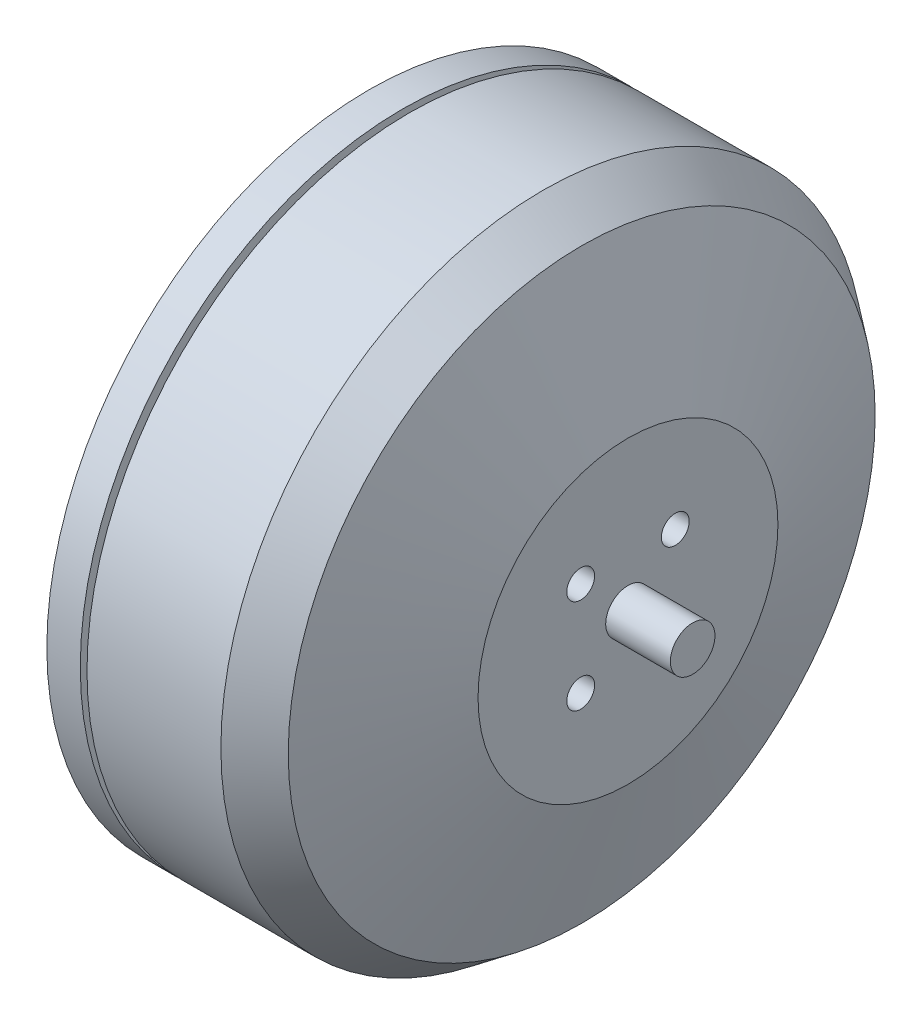
ISO-10303-21;
HEADER;
FILE_DESCRIPTION(('STEP AP214'),'2;1');
FILE_NAME('part.step','',(''),(''),'','','');
FILE_SCHEMA(('AUTOMOTIVE_DESIGN { 1 0 10303 214 1 1 1 1 }'));
ENDSEC;
DATA;
#1=APPLICATION_CONTEXT('core data for automotive mechanical design processes');
#2=APPLICATION_PROTOCOL_DEFINITION('international standard','automotive_design',2000,#1);
#3=PRODUCT_CONTEXT('',#1,'mechanical');
#4=PRODUCT('Part','Part','',(#3));
#5=PRODUCT_RELATED_PRODUCT_CATEGORY('part','',(#4));
#6=PRODUCT_DEFINITION_FORMATION('','',#4);
#7=PRODUCT_DEFINITION_CONTEXT('part definition',#1,'design');
#8=PRODUCT_DEFINITION('design','',#6,#7);
#9=PRODUCT_DEFINITION_SHAPE('','',#8);
#10=(LENGTH_UNIT() NAMED_UNIT(*) SI_UNIT(.MILLI.,.METRE.));
#11=(NAMED_UNIT(*) PLANE_ANGLE_UNIT() SI_UNIT($,.RADIAN.));
#12=(NAMED_UNIT(*) SI_UNIT($,.STERADIAN.) SOLID_ANGLE_UNIT());
#13=UNCERTAINTY_MEASURE_WITH_UNIT(LENGTH_MEASURE(1.E-05),#10,'distance_accuracy_value','');
#14=(GEOMETRIC_REPRESENTATION_CONTEXT(3) GLOBAL_UNCERTAINTY_ASSIGNED_CONTEXT((#13)) GLOBAL_UNIT_ASSIGNED_CONTEXT((#10,
#11,#12)) REPRESENTATION_CONTEXT('',''));
#15=CARTESIAN_POINT('',(0.,0.,0.));
#16=DIRECTION('',(0.,0.,1.));
#17=DIRECTION('',(1.,0.,0.));
#18=AXIS2_PLACEMENT_3D('',#15,#16,#17);
#19=CARTESIAN_POINT('',(3.21405275380118,-34.5,0.));
#20=DIRECTION('',(0.,1.,0.));
#21=DIRECTION('',(0.,0.,1.));
#22=AXIS2_PLACEMENT_3D('',#19,#20,#21);
#23=CYLINDRICAL_SURFACE('',#22,1.15);
#24=CARTESIAN_POINT('',(3.21405275380118,-34.5,0.));
#25=DIRECTION('',(0.,1.,0.));
#26=DIRECTION('',(0.,0.,1.));
#27=AXIS2_PLACEMENT_3D('',#24,#25,#26);
#28=CIRCLE('',#27,1.15);
#29=CARTESIAN_POINT('',(3.21405275380118,-34.5,1.15));
#30=VERTEX_POINT('',#29);
#31=EDGE_CURVE('E11',#30,#30,#28,.T.);
#32=ORIENTED_EDGE('',*,*,#31,.T.);
#33=EDGE_LOOP('',(#32));
#34=FACE_BOUND('',#33,.T.);
#35=CARTESIAN_POINT('',(3.21405275380118,-19.5,0.));
#36=DIRECTION('',(0.,1.,0.));
#37=DIRECTION('',(0.,0.,1.));
#38=AXIS2_PLACEMENT_3D('',#35,#36,#37);
#39=CIRCLE('',#38,1.15);
#40=CARTESIAN_POINT('',(3.21405275380118,-19.5,1.15));
#41=VERTEX_POINT('',#40);
#42=EDGE_CURVE('E45',#41,#41,#39,.T.);
#43=ORIENTED_EDGE('',*,*,#42,.F.);
#44=EDGE_LOOP('',(#43));
#45=FACE_BOUND('',#44,.T.);
#46=ADVANCED_FACE('F42',(#34,#45),#23,.T.);
#47=CARTESIAN_POINT('',(3.21405275380118,-34.5,0.));
#48=DIRECTION('',(0.,1.,0.));
#49=DIRECTION('',(0.,0.,1.));
#50=AXIS2_PLACEMENT_3D('',#47,#48,#49);
#51=PLANE('',#50);
#52=ORIENTED_EDGE('',*,*,#31,.F.);
#53=EDGE_LOOP('',(#52));
#54=FACE_BOUND('',#53,.T.);
#55=ADVANCED_FACE('F57',(#54),#51,.F.);
#56=CARTESIAN_POINT('',(3.21405275380118,-19.5,0.));
#57=DIRECTION('',(0.,1.,0.));
#58=DIRECTION('',(0.,0.,1.));
#59=AXIS2_PLACEMENT_3D('',#56,#57,#58);
#60=PLANE('',#59);
#61=ORIENTED_EDGE('',*,*,#42,.T.);
#62=EDGE_LOOP('',(#61));
#63=FACE_BOUND('',#62,.T.);
#64=ADVANCED_FACE('F54',(#63),#60,.T.);
#65=CLOSED_SHELL('',(#46,#55,#64));
#66=MANIFOLD_SOLID_BREP('B2',#65);
#67=CARTESIAN_POINT('',(3.21405275380118,-34.5,3.));
#68=DIRECTION('',(0.,1.,0.));
#69=DIRECTION('',(0.,0.,1.));
#70=AXIS2_PLACEMENT_3D('',#67,#68,#69);
#71=CYLINDRICAL_SURFACE('',#70,1.15);
#72=CARTESIAN_POINT('',(3.21405275380118,-34.5,3.));
#73=DIRECTION('',(0.,1.,0.));
#74=DIRECTION('',(0.,0.,1.));
#75=AXIS2_PLACEMENT_3D('',#72,#73,#74);
#76=CIRCLE('',#75,1.15);
#77=CARTESIAN_POINT('',(3.21405275380118,-34.5,4.15));
#78=VERTEX_POINT('',#77);
#79=EDGE_CURVE('E41',#78,#78,#76,.T.);
#80=ORIENTED_EDGE('',*,*,#79,.T.);
#81=EDGE_LOOP('',(#80));
#82=FACE_BOUND('',#81,.T.);
#83=CARTESIAN_POINT('',(3.21405275380118,-19.5,3.));
#84=DIRECTION('',(0.,1.,0.));
#85=DIRECTION('',(0.,0.,1.));
#86=AXIS2_PLACEMENT_3D('',#83,#84,#85);
#87=CIRCLE('',#86,1.15);
#88=CARTESIAN_POINT('',(3.21405275380118,-19.5,4.15));
#89=VERTEX_POINT('',#88);
#90=EDGE_CURVE('E100',#89,#89,#87,.T.);
#91=ORIENTED_EDGE('',*,*,#90,.F.);
#92=EDGE_LOOP('',(#91));
#93=FACE_BOUND('',#92,.T.);
#94=ADVANCED_FACE('F97',(#82,#93),#71,.T.);
#95=CARTESIAN_POINT('',(3.21405275380118,-34.5,3.));
#96=DIRECTION('',(0.,1.,0.));
#97=DIRECTION('',(0.,0.,1.));
#98=AXIS2_PLACEMENT_3D('',#95,#96,#97);
#99=PLANE('',#98);
#100=ORIENTED_EDGE('',*,*,#79,.F.);
#101=EDGE_LOOP('',(#100));
#102=FACE_BOUND('',#101,.T.);
#103=ADVANCED_FACE('F112',(#102),#99,.F.);
#104=CARTESIAN_POINT('',(3.21405275380118,-19.5,3.));
#105=DIRECTION('',(0.,1.,0.));
#106=DIRECTION('',(0.,0.,1.));
#107=AXIS2_PLACEMENT_3D('',#104,#105,#106);
#108=PLANE('',#107);
#109=ORIENTED_EDGE('',*,*,#90,.T.);
#110=EDGE_LOOP('',(#109));
#111=FACE_BOUND('',#110,.T.);
#112=ADVANCED_FACE('F109',(#111),#108,.T.);
#113=CLOSED_SHELL('',(#94,#103,#112));
#114=MANIFOLD_SOLID_BREP('B6',#113);
#115=CARTESIAN_POINT('',(3.21405275380118,-34.5,-3.));
#116=DIRECTION('',(0.,1.,0.));
#117=DIRECTION('',(0.,0.,1.));
#118=AXIS2_PLACEMENT_3D('',#115,#116,#117);
#119=CYLINDRICAL_SURFACE('',#118,1.15);
#120=CARTESIAN_POINT('',(3.21405275380118,-34.5,-3.));
#121=DIRECTION('',(0.,1.,0.));
#122=DIRECTION('',(0.,0.,1.));
#123=AXIS2_PLACEMENT_3D('',#120,#121,#122);
#124=CIRCLE('',#123,1.15);
#125=CARTESIAN_POINT('',(3.21405275380118,-34.5,-1.85));
#126=VERTEX_POINT('',#125);
#127=EDGE_CURVE('E96',#126,#126,#124,.T.);
#128=ORIENTED_EDGE('',*,*,#127,.T.);
#129=EDGE_LOOP('',(#128));
#130=FACE_BOUND('',#129,.T.);
#131=CARTESIAN_POINT('',(3.21405275380118,-19.5,-3.));
#132=DIRECTION('',(0.,1.,0.));
#133=DIRECTION('',(0.,0.,1.));
#134=AXIS2_PLACEMENT_3D('',#131,#132,#133);
#135=CIRCLE('',#134,1.15);
#136=CARTESIAN_POINT('',(3.21405275380118,-19.5,-1.85));
#137=VERTEX_POINT('',#136);
#138=EDGE_CURVE('E155',#137,#137,#135,.T.);
#139=ORIENTED_EDGE('',*,*,#138,.F.);
#140=EDGE_LOOP('',(#139));
#141=FACE_BOUND('',#140,.T.);
#142=ADVANCED_FACE('F152',(#130,#141),#119,.T.);
#143=CARTESIAN_POINT('',(3.21405275380118,-34.5,-3.));
#144=DIRECTION('',(0.,1.,0.));
#145=DIRECTION('',(0.,0.,1.));
#146=AXIS2_PLACEMENT_3D('',#143,#144,#145);
#147=PLANE('',#146);
#148=ORIENTED_EDGE('',*,*,#127,.F.);
#149=EDGE_LOOP('',(#148));
#150=FACE_BOUND('',#149,.T.);
#151=ADVANCED_FACE('F167',(#150),#147,.F.);
#152=CARTESIAN_POINT('',(3.21405275380118,-19.5,-3.));
#153=DIRECTION('',(0.,1.,0.));
#154=DIRECTION('',(0.,0.,1.));
#155=AXIS2_PLACEMENT_3D('',#152,#153,#154);
#156=PLANE('',#155);
#157=ORIENTED_EDGE('',*,*,#138,.T.);
#158=EDGE_LOOP('',(#157));
#159=FACE_BOUND('',#158,.T.);
#160=ADVANCED_FACE('F164',(#159),#156,.T.);
#161=CLOSED_SHELL('',(#142,#151,#160));
#162=MANIFOLD_SOLID_BREP('B36',#161);
#163=CARTESIAN_POINT('',(3.21405275380118,-34.5,0.));
#164=DIRECTION('',(0.,1.,0.));
#165=DIRECTION('',(0.,0.,1.));
#166=AXIS2_PLACEMENT_3D('',#163,#164,#165);
#167=CYLINDRICAL_SURFACE('',#166,1.15);
#168=CARTESIAN_POINT('',(3.21405275380118,-34.5,0.));
#169=DIRECTION('',(0.,1.,0.));
#170=DIRECTION('',(0.,0.,1.));
#171=AXIS2_PLACEMENT_3D('',#168,#169,#170);
#172=CIRCLE('',#171,1.15);
#173=CARTESIAN_POINT('',(3.21405275380118,-34.5,1.15));
#174=VERTEX_POINT('',#173);
#175=EDGE_CURVE('E151',#174,#174,#172,.T.);
#176=ORIENTED_EDGE('',*,*,#175,.T.);
#177=EDGE_LOOP('',(#176));
#178=FACE_BOUND('',#177,.T.);
#179=CARTESIAN_POINT('',(3.21405275380118,-19.5,0.));
#180=DIRECTION('',(0.,1.,0.));
#181=DIRECTION('',(0.,0.,1.));
#182=AXIS2_PLACEMENT_3D('',#179,#180,#181);
#183=CIRCLE('',#182,1.15);
#184=CARTESIAN_POINT('',(3.21405275380118,-19.5,1.15));
#185=VERTEX_POINT('',#184);
#186=EDGE_CURVE('E211',#185,#185,#183,.T.);
#187=ORIENTED_EDGE('',*,*,#186,.F.);
#188=EDGE_LOOP('',(#187));
#189=FACE_BOUND('',#188,.T.);
#190=ADVANCED_FACE('F208',(#178,#189),#167,.T.);
#191=CARTESIAN_POINT('',(3.21405275380118,-34.5,0.));
#192=DIRECTION('',(0.,1.,0.));
#193=DIRECTION('',(0.,0.,1.));
#194=AXIS2_PLACEMENT_3D('',#191,#192,#193);
#195=PLANE('',#194);
#196=ORIENTED_EDGE('',*,*,#175,.F.);
#197=EDGE_LOOP('',(#196));
#198=FACE_BOUND('',#197,.T.);
#199=ADVANCED_FACE('F223',(#198),#195,.F.);
#200=CARTESIAN_POINT('',(3.21405275380118,-19.5,0.));
#201=DIRECTION('',(0.,1.,0.));
#202=DIRECTION('',(0.,0.,1.));
#203=AXIS2_PLACEMENT_3D('',#200,#201,#202);
#204=PLANE('',#203);
#205=ORIENTED_EDGE('',*,*,#186,.T.);
#206=EDGE_LOOP('',(#205));
#207=FACE_BOUND('',#206,.T.);
#208=ADVANCED_FACE('F220',(#207),#204,.T.);
#209=CLOSED_SHELL('',(#190,#199,#208));
#210=MANIFOLD_SOLID_BREP('B91',#209);
#211=CARTESIAN_POINT('',(0.,0.,0.));
#212=DIRECTION('',(-1.,0.,0.));
#213=DIRECTION('',(0.,-1.,0.));
#214=AXIS2_PLACEMENT_3D('',#211,#212,#213);
#215=PLANE('',#214);
#216=CARTESIAN_POINT('',(0.,0.,0.));
#217=DIRECTION('',(1.,0.,0.));
#218=DIRECTION('',(0.,1.,0.));
#219=AXIS2_PLACEMENT_3D('',#216,#217,#218);
#220=CIRCLE('',#219,4.25);
#221=CARTESIAN_POINT('',(0.,4.25,0.));
#222=VERTEX_POINT('',#221);
#223=EDGE_CURVE('E206',#222,#222,#220,.T.);
#224=ORIENTED_EDGE('',*,*,#223,.F.);
#225=EDGE_LOOP('',(#224));
#226=FACE_BOUND('',#225,.T.);
#227=ADVANCED_FACE('F248',(#226),#215,.T.);
#228=CARTESIAN_POINT('',(36.1,0.,0.));
#229=DIRECTION('',(1.,0.,0.));
#230=DIRECTION('',(0.,1.,0.));
#231=AXIS2_PLACEMENT_3D('',#228,#229,#230);
#232=CYLINDRICAL_SURFACE('',#231,4.25);
#233=ORIENTED_EDGE('',*,*,#223,.T.);
#234=EDGE_LOOP('',(#233));
#235=FACE_BOUND('',#234,.T.);
#236=CARTESIAN_POINT('',(4.8,0.,0.));
#237=DIRECTION('',(1.,0.,0.));
#238=DIRECTION('',(0.,1.,0.));
#239=AXIS2_PLACEMENT_3D('',#236,#237,#238);
#240=CIRCLE('',#239,4.25);
#241=CARTESIAN_POINT('',(4.8,4.25,0.));
#242=VERTEX_POINT('',#241);
#243=EDGE_CURVE('E255',#242,#242,#240,.T.);
#244=ORIENTED_EDGE('',*,*,#243,.F.);
#245=EDGE_LOOP('',(#244));
#246=FACE_BOUND('',#245,.T.);
#247=ADVANCED_FACE('F381',(#235,#246),#232,.T.);
#248=CARTESIAN_POINT('',(4.8,4.25,0.));
#249=DIRECTION('',(-1.,0.,0.));
#250=DIRECTION('',(0.,-1.,0.));
#251=AXIS2_PLACEMENT_3D('',#248,#249,#250);
#252=PLANE('',#251);
#253=ORIENTED_EDGE('',*,*,#243,.T.);
#254=EDGE_LOOP('',(#253));
#255=FACE_BOUND('',#254,.T.);
#256=CARTESIAN_POINT('',(4.8,0.,0.));
#257=DIRECTION('',(1.,0.,0.));
#258=DIRECTION('',(0.,1.,0.));
#259=AXIS2_PLACEMENT_3D('',#256,#257,#258);
#260=CIRCLE('',#259,7.35);
#261=CARTESIAN_POINT('',(4.8,7.35,0.));
#262=VERTEX_POINT('',#261);
#263=EDGE_CURVE('E373',#262,#262,#260,.T.);
#264=ORIENTED_EDGE('',*,*,#263,.F.);
#265=EDGE_LOOP('',(#264));
#266=FACE_BOUND('',#265,.T.);
#267=ADVANCED_FACE('F378',(#255,#266),#252,.T.);
#268=CARTESIAN_POINT('',(2.3,0.,0.));
#269=DIRECTION('',(-1.,0.,0.));
#270=DIRECTION('',(0.,-1.,0.));
#271=AXIS2_PLACEMENT_3D('',#268,#269,#270);
#272=CONICAL_SURFACE('',#271,8.75,0.510488321916777);
#273=ORIENTED_EDGE('',*,*,#263,.T.);
#274=EDGE_LOOP('',(#273));
#275=FACE_BOUND('',#274,.T.);
#276=CARTESIAN_POINT('',(2.3,0.,0.));
#277=DIRECTION('',(1.,0.,0.));
#278=DIRECTION('',(0.,1.,0.));
#279=AXIS2_PLACEMENT_3D('',#276,#277,#278);
#280=CIRCLE('',#279,8.75);
#281=CARTESIAN_POINT('',(2.3,8.75,0.));
#282=VERTEX_POINT('',#281);
#283=EDGE_CURVE('E370',#282,#282,#280,.T.);
#284=ORIENTED_EDGE('',*,*,#283,.F.);
#285=EDGE_LOOP('',(#284));
#286=FACE_BOUND('',#285,.T.);
#287=ADVANCED_FACE('F388',(#275,#286),#272,.F.);
#288=CARTESIAN_POINT('',(2.3,8.75,0.));
#289=DIRECTION('',(-1.,0.,0.));
#290=DIRECTION('',(0.,-1.,0.));
#291=AXIS2_PLACEMENT_3D('',#288,#289,#290);
#292=PLANE('',#291);
#293=CARTESIAN_POINT('',(2.3,8.83883476483184,-8.83883476483184));
#294=DIRECTION('',(-1.,0.,0.));
#295=DIRECTION('',(0.,0.,1.));
#296=AXIS2_PLACEMENT_3D('',#293,#294,#295);
#297=CIRCLE('',#296,1.24999999999999);
#298=CARTESIAN_POINT('',(2.3,8.83883476483184,-7.58883476483185));
#299=VERTEX_POINT('',#298);
#300=EDGE_CURVE('E313',#299,#299,#297,.T.);
#301=ORIENTED_EDGE('',*,*,#300,.F.);
#302=EDGE_LOOP('',(#301));
#303=FACE_BOUND('',#302,.T.);
#304=CARTESIAN_POINT('',(2.30000000000001,-8.83883476483185,8.83883476483185));
#305=DIRECTION('',(-1.,0.,0.));
#306=DIRECTION('',(0.,0.,1.));
#307=AXIS2_PLACEMENT_3D('',#304,#305,#306);
#308=CIRCLE('',#307,1.24999999999999);
#309=CARTESIAN_POINT('',(2.30000000000001,-8.83883476483185,10.0888347648318));
#310=VERTEX_POINT('',#309);
#311=EDGE_CURVE('E319',#310,#310,#308,.T.);
#312=ORIENTED_EDGE('',*,*,#311,.F.);
#313=EDGE_LOOP('',(#312));
#314=FACE_BOUND('',#313,.T.);
#315=CARTESIAN_POINT('',(2.30000000000001,-8.83883476483184,-8.83883476483184));
#316=DIRECTION('',(-1.,0.,0.));
#317=DIRECTION('',(0.,0.,1.));
#318=AXIS2_PLACEMENT_3D('',#315,#316,#317);
#319=CIRCLE('',#318,1.24999999999999);
#320=CARTESIAN_POINT('',(2.30000000000001,-8.83883476483184,-7.58883476483185));
#321=VERTEX_POINT('',#320);
#322=EDGE_CURVE('E325',#321,#321,#319,.T.);
#323=ORIENTED_EDGE('',*,*,#322,.F.);
#324=EDGE_LOOP('',(#323));
#325=FACE_BOUND('',#324,.T.);
#326=CARTESIAN_POINT('',(2.3,8.83883476483185,8.83883476483185));
#327=DIRECTION('',(-1.,0.,0.));
#328=DIRECTION('',(0.,0.,1.));
#329=AXIS2_PLACEMENT_3D('',#326,#327,#328);
#330=CIRCLE('',#329,1.24999999999999);
#331=CARTESIAN_POINT('',(2.3,8.83883476483185,10.0888347648318));
#332=VERTEX_POINT('',#331);
#333=EDGE_CURVE('E331',#332,#332,#330,.T.);
#334=ORIENTED_EDGE('',*,*,#333,.F.);
#335=EDGE_LOOP('',(#334));
#336=FACE_BOUND('',#335,.T.);
#337=ORIENTED_EDGE('',*,*,#283,.T.);
#338=EDGE_LOOP('',(#337));
#339=FACE_BOUND('',#338,.T.);
#340=CARTESIAN_POINT('',(2.3,0.,0.));
#341=DIRECTION('',(1.,0.,0.));
#342=DIRECTION('',(0.,1.,0.));
#343=AXIS2_PLACEMENT_3D('',#340,#341,#342);
#344=CIRCLE('',#343,17.75);
#345=CARTESIAN_POINT('',(2.3,17.75,0.));
#346=VERTEX_POINT('',#345);
#347=EDGE_CURVE('E367',#346,#346,#344,.T.);
#348=ORIENTED_EDGE('',*,*,#347,.F.);
#349=EDGE_LOOP('',(#348));
#350=FACE_BOUND('',#349,.T.);
#351=ADVANCED_FACE('F394',(#303,#314,#325,#336,#339,#350),#292,.T.);
#352=CARTESIAN_POINT('',(7.0795886282512,0.,0.));
#353=DIRECTION('',(1.,0.,0.));
#354=DIRECTION('',(0.,1.,0.));
#355=AXIS2_PLACEMENT_3D('',#352,#353,#354);
#356=CONICAL_SURFACE('',#355,28.9,1.1658274705579);
#357=ORIENTED_EDGE('',*,*,#347,.T.);
#358=EDGE_LOOP('',(#357));
#359=FACE_BOUND('',#358,.T.);
#360=CARTESIAN_POINT('',(7.0795886282512,0.,0.));
#361=DIRECTION('',(1.,0.,0.));
#362=DIRECTION('',(0.,1.,0.));
#363=AXIS2_PLACEMENT_3D('',#360,#361,#362);
#364=CIRCLE('',#363,28.9);
#365=CARTESIAN_POINT('',(7.0795886282512,28.9,0.));
#366=VERTEX_POINT('',#365);
#367=EDGE_CURVE('E364',#366,#366,#364,.T.);
#368=ORIENTED_EDGE('',*,*,#367,.F.);
#369=EDGE_LOOP('',(#368));
#370=FACE_BOUND('',#369,.T.);
#371=ADVANCED_FACE('F398',(#359,#370),#356,.T.);
#372=CARTESIAN_POINT('',(36.1,0.,0.));
#373=DIRECTION('',(1.,0.,0.));
#374=DIRECTION('',(0.,1.,0.));
#375=AXIS2_PLACEMENT_3D('',#372,#373,#374);
#376=CYLINDRICAL_SURFACE('',#375,28.9);
#377=ORIENTED_EDGE('',*,*,#367,.T.);
#378=EDGE_LOOP('',(#377));
#379=FACE_BOUND('',#378,.T.);
#380=CARTESIAN_POINT('',(10.0795886282512,0.,0.));
#381=DIRECTION('',(1.,0.,0.));
#382=DIRECTION('',(0.,1.,0.));
#383=AXIS2_PLACEMENT_3D('',#380,#381,#382);
#384=CIRCLE('',#383,28.9);
#385=CARTESIAN_POINT('',(10.0795886282512,28.9,0.));
#386=VERTEX_POINT('',#385);
#387=EDGE_CURVE('E361',#386,#386,#384,.T.);
#388=ORIENTED_EDGE('',*,*,#387,.F.);
#389=EDGE_LOOP('',(#388));
#390=FACE_BOUND('',#389,.T.);
#391=ADVANCED_FACE('F402',(#379,#390),#376,.T.);
#392=CARTESIAN_POINT('',(10.0795886282512,28.9,0.));
#393=DIRECTION('',(1.,0.,0.));
#394=DIRECTION('',(0.,1.,0.));
#395=AXIS2_PLACEMENT_3D('',#392,#393,#394);
#396=PLANE('',#395);
#397=ORIENTED_EDGE('',*,*,#387,.T.);
#398=EDGE_LOOP('',(#397));
#399=FACE_BOUND('',#398,.T.);
#400=CARTESIAN_POINT('',(10.0795886282512,0.,0.));
#401=DIRECTION('',(1.,0.,0.));
#402=DIRECTION('',(0.,1.,0.));
#403=AXIS2_PLACEMENT_3D('',#400,#401,#402);
#404=CIRCLE('',#403,24.4265978755839);
#405=CARTESIAN_POINT('',(10.0795886282512,24.4265978755839,0.));
#406=VERTEX_POINT('',#405);
#407=EDGE_CURVE('E358',#406,#406,#404,.T.);
#408=ORIENTED_EDGE('',*,*,#407,.F.);
#409=EDGE_LOOP('',(#408));
#410=FACE_BOUND('',#409,.T.);
#411=ADVANCED_FACE('F406',(#399,#410),#396,.T.);
#412=CARTESIAN_POINT('',(36.1,0.,0.));
#413=DIRECTION('',(1.,0.,0.));
#414=DIRECTION('',(0.,1.,0.));
#415=AXIS2_PLACEMENT_3D('',#412,#413,#414);
#416=CYLINDRICAL_SURFACE('',#415,24.4265978755839);
#417=ORIENTED_EDGE('',*,*,#407,.T.);
#418=EDGE_LOOP('',(#417));
#419=FACE_BOUND('',#418,.T.);
#420=CARTESIAN_POINT('',(10.6795886282512,0.,0.));
#421=DIRECTION('',(1.,0.,0.));
#422=DIRECTION('',(0.,1.,0.));
#423=AXIS2_PLACEMENT_3D('',#420,#421,#422);
#424=CIRCLE('',#423,24.4265978755839);
#425=CARTESIAN_POINT('',(10.6795886282512,24.4265978755839,0.));
#426=VERTEX_POINT('',#425);
#427=EDGE_CURVE('E355',#426,#426,#424,.T.);
#428=ORIENTED_EDGE('',*,*,#427,.F.);
#429=EDGE_LOOP('',(#428));
#430=FACE_BOUND('',#429,.T.);
#431=ADVANCED_FACE('F410',(#419,#430),#416,.T.);
#432=CARTESIAN_POINT('',(10.6795886282512,24.4265978755839,0.));
#433=DIRECTION('',(-1.,0.,0.));
#434=DIRECTION('',(0.,-1.,0.));
#435=AXIS2_PLACEMENT_3D('',#432,#433,#434);
#436=PLANE('',#435);
#437=ORIENTED_EDGE('',*,*,#427,.T.);
#438=EDGE_LOOP('',(#437));
#439=FACE_BOUND('',#438,.T.);
#440=CARTESIAN_POINT('',(10.6795886282512,0.,0.));
#441=DIRECTION('',(1.,0.,0.));
#442=DIRECTION('',(0.,1.,0.));
#443=AXIS2_PLACEMENT_3D('',#440,#441,#442);
#444=CIRCLE('',#443,28.9);
#445=CARTESIAN_POINT('',(10.6795886282512,28.9,0.));
#446=VERTEX_POINT('',#445);
#447=EDGE_CURVE('E352',#446,#446,#444,.T.);
#448=ORIENTED_EDGE('',*,*,#447,.F.);
#449=EDGE_LOOP('',(#448));
#450=FACE_BOUND('',#449,.T.);
#451=ADVANCED_FACE('F414',(#439,#450),#436,.T.);
#452=CARTESIAN_POINT('',(36.1,0.,0.));
#453=DIRECTION('',(1.,0.,0.));
#454=DIRECTION('',(0.,1.,0.));
#455=AXIS2_PLACEMENT_3D('',#452,#453,#454);
#456=CYLINDRICAL_SURFACE('',#455,28.9);
#457=ORIENTED_EDGE('',*,*,#447,.T.);
#458=EDGE_LOOP('',(#457));
#459=FACE_BOUND('',#458,.T.);
#460=CARTESIAN_POINT('',(22.6887971494668,0.,0.));
#461=DIRECTION('',(1.,0.,0.));
#462=DIRECTION('',(0.,1.,0.));
#463=AXIS2_PLACEMENT_3D('',#460,#461,#462);
#464=CIRCLE('',#463,28.9);
#465=CARTESIAN_POINT('',(22.6887971494668,28.9,0.));
#466=VERTEX_POINT('',#465);
#467=EDGE_CURVE('E349',#466,#466,#464,.T.);
#468=ORIENTED_EDGE('',*,*,#467,.F.);
#469=EDGE_LOOP('',(#468));
#470=FACE_BOUND('',#469,.T.);
#471=ADVANCED_FACE('F418',(#459,#470),#456,.T.);
#472=CARTESIAN_POINT('',(26.1490986979272,0.,0.));
#473=DIRECTION('',(-1.,0.,0.));
#474=DIRECTION('',(0.,-1.,0.));
#475=AXIS2_PLACEMENT_3D('',#472,#473,#474);
#476=CONICAL_SURFACE('',#475,26.3187733167813,0.640906803396216);
#477=ORIENTED_EDGE('',*,*,#467,.T.);
#478=EDGE_LOOP('',(#477));
#479=FACE_BOUND('',#478,.T.);
#480=CARTESIAN_POINT('',(26.1490986979272,0.,0.));
#481=DIRECTION('',(1.,0.,0.));
#482=DIRECTION('',(0.,1.,0.));
#483=AXIS2_PLACEMENT_3D('',#480,#481,#482);
#484=CIRCLE('',#483,26.3187733167813);
#485=CARTESIAN_POINT('',(26.1490986979272,26.3187733167813,0.));
#486=VERTEX_POINT('',#485);
#487=EDGE_CURVE('E346',#486,#486,#484,.T.);
#488=ORIENTED_EDGE('',*,*,#487,.F.);
#489=EDGE_LOOP('',(#488));
#490=FACE_BOUND('',#489,.T.);
#491=ADVANCED_FACE('F422',(#479,#490),#476,.T.);
#492=CARTESIAN_POINT('',(30.3,0.,0.));
#493=DIRECTION('',(-1.,0.,0.));
#494=DIRECTION('',(0.,-1.,0.));
#495=AXIS2_PLACEMENT_3D('',#492,#493,#494);
#496=CONICAL_SURFACE('',#495,13.4488648353622,1.25880220884998);
#497=ORIENTED_EDGE('',*,*,#487,.T.);
#498=EDGE_LOOP('',(#497));
#499=FACE_BOUND('',#498,.T.);
#500=CARTESIAN_POINT('',(30.3,0.,0.));
#501=DIRECTION('',(1.,0.,0.));
#502=DIRECTION('',(0.,1.,0.));
#503=AXIS2_PLACEMENT_3D('',#500,#501,#502);
#504=CIRCLE('',#503,13.4488648353622);
#505=CARTESIAN_POINT('',(30.3,13.4488648353622,0.));
#506=VERTEX_POINT('',#505);
#507=EDGE_CURVE('E343',#506,#506,#504,.T.);
#508=ORIENTED_EDGE('',*,*,#507,.F.);
#509=EDGE_LOOP('',(#508));
#510=FACE_BOUND('',#509,.T.);
#511=ADVANCED_FACE('F426',(#499,#510),#496,.T.);
#512=CARTESIAN_POINT('',(30.3,13.4488648353622,0.));
#513=DIRECTION('',(1.,0.,0.));
#514=DIRECTION('',(0.,1.,0.));
#515=AXIS2_PLACEMENT_3D('',#512,#513,#514);
#516=PLANE('',#515);
#517=CARTESIAN_POINT('',(30.3,4.24264068711929,4.24264068711928));
#518=DIRECTION('',(1.,0.,0.));
#519=DIRECTION('',(0.,0.,-1.));
#520=AXIS2_PLACEMENT_3D('',#517,#518,#519);
#521=CIRCLE('',#520,1.24999999999999);
#522=CARTESIAN_POINT('',(30.3,4.24264068711929,2.99264068711929));
#523=VERTEX_POINT('',#522);
#524=EDGE_CURVE('E291',#523,#523,#521,.T.);
#525=ORIENTED_EDGE('',*,*,#524,.F.);
#526=EDGE_LOOP('',(#525));
#527=FACE_BOUND('',#526,.T.);
#528=CARTESIAN_POINT('',(30.3,-4.24264068711928,-4.24264068711929));
#529=DIRECTION('',(1.,0.,0.));
#530=DIRECTION('',(0.,0.,-1.));
#531=AXIS2_PLACEMENT_3D('',#528,#529,#530);
#532=CIRCLE('',#531,1.24999999999999);
#533=CARTESIAN_POINT('',(30.3,-4.24264068711928,-5.49264068711928));
#534=VERTEX_POINT('',#533);
#535=EDGE_CURVE('E290',#534,#534,#532,.T.);
#536=ORIENTED_EDGE('',*,*,#535,.F.);
#537=EDGE_LOOP('',(#536));
#538=FACE_BOUND('',#537,.T.);
#539=CARTESIAN_POINT('',(30.3,-4.24264068711928,4.24264068711928));
#540=DIRECTION('',(1.,0.,0.));
#541=DIRECTION('',(0.,0.,-1.));
#542=AXIS2_PLACEMENT_3D('',#539,#540,#541);
#543=CIRCLE('',#542,1.24999999999999);
#544=CARTESIAN_POINT('',(30.3,-4.24264068711928,2.99264068711929));
#545=VERTEX_POINT('',#544);
#546=EDGE_CURVE('E301',#545,#545,#543,.T.);
#547=ORIENTED_EDGE('',*,*,#546,.F.);
#548=EDGE_LOOP('',(#547));
#549=FACE_BOUND('',#548,.T.);
#550=CARTESIAN_POINT('',(30.3,4.24264068711929,-4.24264068711929));
#551=DIRECTION('',(1.,0.,0.));
#552=DIRECTION('',(0.,0.,-1.));
#553=AXIS2_PLACEMENT_3D('',#550,#551,#552);
#554=CIRCLE('',#553,1.24999999999999);
#555=CARTESIAN_POINT('',(30.3,4.24264068711929,-5.49264068711928));
#556=VERTEX_POINT('',#555);
#557=EDGE_CURVE('E307',#556,#556,#554,.T.);
#558=ORIENTED_EDGE('',*,*,#557,.F.);
#559=EDGE_LOOP('',(#558));
#560=FACE_BOUND('',#559,.T.);
#561=ORIENTED_EDGE('',*,*,#507,.T.);
#562=EDGE_LOOP('',(#561));
#563=FACE_BOUND('',#562,.T.);
#564=CARTESIAN_POINT('',(30.3,0.,0.));
#565=DIRECTION('',(1.,0.,0.));
#566=DIRECTION('',(0.,1.,0.));
#567=AXIS2_PLACEMENT_3D('',#564,#565,#566);
#568=CIRCLE('',#567,2.);
#569=CARTESIAN_POINT('',(30.3,2.,0.));
#570=VERTEX_POINT('',#569);
#571=EDGE_CURVE('E340',#570,#570,#568,.T.);
#572=ORIENTED_EDGE('',*,*,#571,.F.);
#573=EDGE_LOOP('',(#572));
#574=FACE_BOUND('',#573,.T.);
#575=ADVANCED_FACE('F430',(#527,#538,#549,#560,#563,#574),#516,.T.);
#576=CARTESIAN_POINT('',(36.1,0.,0.));
#577=DIRECTION('',(1.,0.,0.));
#578=DIRECTION('',(0.,1.,0.));
#579=AXIS2_PLACEMENT_3D('',#576,#577,#578);
#580=CYLINDRICAL_SURFACE('',#579,2.);
#581=ORIENTED_EDGE('',*,*,#571,.T.);
#582=EDGE_LOOP('',(#581));
#583=FACE_BOUND('',#582,.T.);
#584=CARTESIAN_POINT('',(36.1,0.,0.));
#585=DIRECTION('',(1.,0.,0.));
#586=DIRECTION('',(0.,1.,0.));
#587=AXIS2_PLACEMENT_3D('',#584,#585,#586);
#588=CIRCLE('',#587,2.);
#589=CARTESIAN_POINT('',(36.1,2.,0.));
#590=VERTEX_POINT('',#589);
#591=EDGE_CURVE('E337',#590,#590,#588,.T.);
#592=ORIENTED_EDGE('',*,*,#591,.F.);
#593=EDGE_LOOP('',(#592));
#594=FACE_BOUND('',#593,.T.);
#595=ADVANCED_FACE('F434',(#583,#594),#580,.T.);
#596=CARTESIAN_POINT('',(36.1,2.,0.));
#597=DIRECTION('',(1.,0.,0.));
#598=DIRECTION('',(0.,1.,0.));
#599=AXIS2_PLACEMENT_3D('',#596,#597,#598);
#600=PLANE('',#599);
#601=ORIENTED_EDGE('',*,*,#591,.T.);
#602=EDGE_LOOP('',(#601));
#603=FACE_BOUND('',#602,.T.);
#604=ADVANCED_FACE('F438',(#603),#600,.T.);
#605=CARTESIAN_POINT('',(5.9,8.83883476483185,8.83883476483185));
#606=DIRECTION('',(-1.,0.,0.));
#607=DIRECTION('',(0.,0.,1.));
#608=AXIS2_PLACEMENT_3D('',#605,#606,#607);
#609=CONICAL_SURFACE('',#608,1.25,1.02974425867665);
#610=CARTESIAN_POINT('',(6.65107577378445,8.83883476483185,8.83883476483185));
#611=VERTEX_POINT('',#610);
#612=VERTEX_LOOP('',#611);
#613=FACE_BOUND('',#612,.T.);
#614=CARTESIAN_POINT('',(5.9,8.83883476483185,8.83883476483185));
#615=DIRECTION('',(-1.,0.,0.));
#616=DIRECTION('',(0.,0.,1.));
#617=AXIS2_PLACEMENT_3D('',#614,#615,#616);
#618=CIRCLE('',#617,1.25);
#619=CARTESIAN_POINT('',(5.9,8.83883476483185,10.0888347648318));
#620=VERTEX_POINT('',#619);
#621=EDGE_CURVE('E334',#620,#620,#618,.T.);
#622=ORIENTED_EDGE('',*,*,#621,.T.);
#623=EDGE_LOOP('',(#622));
#624=FACE_BOUND('',#623,.T.);
#625=ADVANCED_FACE('F442',(#613,#624),#609,.F.);
#626=CARTESIAN_POINT('',(2.3,8.83883476483185,8.83883476483185));
#627=DIRECTION('',(-1.,0.,0.));
#628=DIRECTION('',(0.,0.,1.));
#629=AXIS2_PLACEMENT_3D('',#626,#627,#628);
#630=CYLINDRICAL_SURFACE('',#629,1.24999999999999);
#631=ORIENTED_EDGE('',*,*,#621,.F.);
#632=EDGE_LOOP('',(#631));
#633=FACE_BOUND('',#632,.T.);
#634=ORIENTED_EDGE('',*,*,#333,.T.);
#635=EDGE_LOOP('',(#634));
#636=FACE_BOUND('',#635,.T.);
#637=ADVANCED_FACE('F446',(#633,#636),#630,.F.);
#638=CARTESIAN_POINT('',(5.90000000000001,-8.83883476483184,-8.83883476483184));
#639=DIRECTION('',(-1.,0.,0.));
#640=DIRECTION('',(0.,0.,1.));
#641=AXIS2_PLACEMENT_3D('',#638,#639,#640);
#642=CONICAL_SURFACE('',#641,1.25,1.02974425867665);
#643=CARTESIAN_POINT('',(6.65107577378446,-8.83883476483185,-8.83883476483184));
#644=VERTEX_POINT('',#643);
#645=VERTEX_LOOP('',#644);
#646=FACE_BOUND('',#645,.T.);
#647=CARTESIAN_POINT('',(5.90000000000001,-8.83883476483184,-8.83883476483184));
#648=DIRECTION('',(-1.,0.,0.));
#649=DIRECTION('',(0.,0.,1.));
#650=AXIS2_PLACEMENT_3D('',#647,#648,#649);
#651=CIRCLE('',#650,1.25);
#652=CARTESIAN_POINT('',(5.90000000000001,-8.83883476483184,-7.58883476483184));
#653=VERTEX_POINT('',#652);
#654=EDGE_CURVE('E328',#653,#653,#651,.T.);
#655=ORIENTED_EDGE('',*,*,#654,.T.);
#656=EDGE_LOOP('',(#655));
#657=FACE_BOUND('',#656,.T.);
#658=ADVANCED_FACE('F449',(#646,#657),#642,.F.);
#659=CARTESIAN_POINT('',(2.30000000000001,-8.83883476483184,-8.83883476483184));
#660=DIRECTION('',(-1.,0.,0.));
#661=DIRECTION('',(0.,0.,1.));
#662=AXIS2_PLACEMENT_3D('',#659,#660,#661);
#663=CYLINDRICAL_SURFACE('',#662,1.24999999999999);
#664=ORIENTED_EDGE('',*,*,#654,.F.);
#665=EDGE_LOOP('',(#664));
#666=FACE_BOUND('',#665,.T.);
#667=ORIENTED_EDGE('',*,*,#322,.T.);
#668=EDGE_LOOP('',(#667));
#669=FACE_BOUND('',#668,.T.);
#670=ADVANCED_FACE('F453',(#666,#669),#663,.F.);
#671=CARTESIAN_POINT('',(5.90000000000001,-8.83883476483185,8.83883476483185));
#672=DIRECTION('',(-1.,0.,0.));
#673=DIRECTION('',(0.,0.,1.));
#674=AXIS2_PLACEMENT_3D('',#671,#672,#673);
#675=CONICAL_SURFACE('',#674,1.25,1.02974425867665);
#676=CARTESIAN_POINT('',(6.65107577378446,-8.83883476483185,8.83883476483185));
#677=VERTEX_POINT('',#676);
#678=VERTEX_LOOP('',#677);
#679=FACE_BOUND('',#678,.T.);
#680=CARTESIAN_POINT('',(5.90000000000001,-8.83883476483185,8.83883476483185));
#681=DIRECTION('',(-1.,0.,0.));
#682=DIRECTION('',(0.,0.,1.));
#683=AXIS2_PLACEMENT_3D('',#680,#681,#682);
#684=CIRCLE('',#683,1.25);
#685=CARTESIAN_POINT('',(5.90000000000001,-8.83883476483185,10.0888347648318));
#686=VERTEX_POINT('',#685);
#687=EDGE_CURVE('E322',#686,#686,#684,.T.);
#688=ORIENTED_EDGE('',*,*,#687,.T.);
#689=EDGE_LOOP('',(#688));
#690=FACE_BOUND('',#689,.T.);
#691=ADVANCED_FACE('F456',(#679,#690),#675,.F.);
#692=CARTESIAN_POINT('',(2.30000000000001,-8.83883476483185,8.83883476483185));
#693=DIRECTION('',(-1.,0.,0.));
#694=DIRECTION('',(0.,0.,1.));
#695=AXIS2_PLACEMENT_3D('',#692,#693,#694);
#696=CYLINDRICAL_SURFACE('',#695,1.24999999999999);
#697=ORIENTED_EDGE('',*,*,#687,.F.);
#698=EDGE_LOOP('',(#697));
#699=FACE_BOUND('',#698,.T.);
#700=ORIENTED_EDGE('',*,*,#311,.T.);
#701=EDGE_LOOP('',(#700));
#702=FACE_BOUND('',#701,.T.);
#703=ADVANCED_FACE('F460',(#699,#702),#696,.F.);
#704=CARTESIAN_POINT('',(5.9,8.83883476483184,-8.83883476483184));
#705=DIRECTION('',(-1.,0.,0.));
#706=DIRECTION('',(0.,0.,1.));
#707=AXIS2_PLACEMENT_3D('',#704,#705,#706);
#708=CONICAL_SURFACE('',#707,1.25,1.02974425867665);
#709=CARTESIAN_POINT('',(6.65107577378445,8.83883476483184,-8.83883476483184));
#710=VERTEX_POINT('',#709);
#711=VERTEX_LOOP('',#710);
#712=FACE_BOUND('',#711,.T.);
#713=CARTESIAN_POINT('',(5.9,8.83883476483184,-8.83883476483184));
#714=DIRECTION('',(-1.,0.,0.));
#715=DIRECTION('',(0.,0.,1.));
#716=AXIS2_PLACEMENT_3D('',#713,#714,#715);
#717=CIRCLE('',#716,1.25);
#718=CARTESIAN_POINT('',(5.9,8.83883476483184,-7.58883476483184));
#719=VERTEX_POINT('',#718);
#720=EDGE_CURVE('E316',#719,#719,#717,.T.);
#721=ORIENTED_EDGE('',*,*,#720,.T.);
#722=EDGE_LOOP('',(#721));
#723=FACE_BOUND('',#722,.T.);
#724=ADVANCED_FACE('F464',(#712,#723),#708,.F.);
#725=CARTESIAN_POINT('',(2.3,8.83883476483184,-8.83883476483184));
#726=DIRECTION('',(-1.,0.,0.));
#727=DIRECTION('',(0.,0.,1.));
#728=AXIS2_PLACEMENT_3D('',#725,#726,#727);
#729=CYLINDRICAL_SURFACE('',#728,1.24999999999999);
#730=ORIENTED_EDGE('',*,*,#720,.F.);
#731=EDGE_LOOP('',(#730));
#732=FACE_BOUND('',#731,.T.);
#733=ORIENTED_EDGE('',*,*,#300,.T.);
#734=EDGE_LOOP('',(#733));
#735=FACE_BOUND('',#734,.T.);
#736=ADVANCED_FACE('F468',(#732,#735),#729,.F.);
#737=CARTESIAN_POINT('',(24.3,4.24264068711929,-4.24264068711929));
#738=DIRECTION('',(1.,0.,0.));
#739=DIRECTION('',(0.,0.,-1.));
#740=AXIS2_PLACEMENT_3D('',#737,#738,#739);
#741=CONICAL_SURFACE('',#740,1.25,1.02974425867665);
#742=CARTESIAN_POINT('',(23.5489242262156,4.24264068711929,-4.24264068711929));
#743=VERTEX_POINT('',#742);
#744=VERTEX_LOOP('',#743);
#745=FACE_BOUND('',#744,.T.);
#746=CARTESIAN_POINT('',(24.3,4.24264068711929,-4.24264068711929));
#747=DIRECTION('',(1.,0.,0.));
#748=DIRECTION('',(0.,0.,-1.));
#749=AXIS2_PLACEMENT_3D('',#746,#747,#748);
#750=CIRCLE('',#749,1.25);
#751=CARTESIAN_POINT('',(24.3,4.24264068711929,-5.49264068711928));
#752=VERTEX_POINT('',#751);
#753=EDGE_CURVE('E310',#752,#752,#750,.T.);
#754=ORIENTED_EDGE('',*,*,#753,.T.);
#755=EDGE_LOOP('',(#754));
#756=FACE_BOUND('',#755,.T.);
#757=ADVANCED_FACE('F472',(#745,#756),#741,.F.);
#758=CARTESIAN_POINT('',(30.3,4.24264068711929,-4.24264068711929));
#759=DIRECTION('',(1.,0.,0.));
#760=DIRECTION('',(0.,0.,-1.));
#761=AXIS2_PLACEMENT_3D('',#758,#759,#760);
#762=CYLINDRICAL_SURFACE('',#761,1.24999999999999);
#763=ORIENTED_EDGE('',*,*,#753,.F.);
#764=EDGE_LOOP('',(#763));
#765=FACE_BOUND('',#764,.T.);
#766=ORIENTED_EDGE('',*,*,#557,.T.);
#767=EDGE_LOOP('',(#766));
#768=FACE_BOUND('',#767,.T.);
#769=ADVANCED_FACE('F476',(#765,#768),#762,.F.);
#770=CARTESIAN_POINT('',(24.3,-4.24264068711928,4.24264068711928));
#771=DIRECTION('',(1.,0.,0.));
#772=DIRECTION('',(0.,0.,-1.));
#773=AXIS2_PLACEMENT_3D('',#770,#771,#772);
#774=CONICAL_SURFACE('',#773,1.25,1.02974425867665);
#775=CARTESIAN_POINT('',(23.5489242262156,-4.24264068711928,4.24264068711928));
#776=VERTEX_POINT('',#775);
#777=VERTEX_LOOP('',#776);
#778=FACE_BOUND('',#777,.T.);
#779=CARTESIAN_POINT('',(24.3,-4.24264068711928,4.24264068711928));
#780=DIRECTION('',(1.,0.,0.));
#781=DIRECTION('',(0.,0.,-1.));
#782=AXIS2_PLACEMENT_3D('',#779,#780,#781);
#783=CIRCLE('',#782,1.25);
#784=CARTESIAN_POINT('',(24.3,-4.24264068711928,2.99264068711929));
#785=VERTEX_POINT('',#784);
#786=EDGE_CURVE('E304',#785,#785,#783,.T.);
#787=ORIENTED_EDGE('',*,*,#786,.T.);
#788=EDGE_LOOP('',(#787));
#789=FACE_BOUND('',#788,.T.);
#790=ADVANCED_FACE('F480',(#778,#789),#774,.F.);
#791=CARTESIAN_POINT('',(30.3,-4.24264068711928,4.24264068711928));
#792=DIRECTION('',(1.,0.,0.));
#793=DIRECTION('',(0.,0.,-1.));
#794=AXIS2_PLACEMENT_3D('',#791,#792,#793);
#795=CYLINDRICAL_SURFACE('',#794,1.24999999999999);
#796=ORIENTED_EDGE('',*,*,#786,.F.);
#797=EDGE_LOOP('',(#796));
#798=FACE_BOUND('',#797,.T.);
#799=ORIENTED_EDGE('',*,*,#546,.T.);
#800=EDGE_LOOP('',(#799));
#801=FACE_BOUND('',#800,.T.);
#802=ADVANCED_FACE('F484',(#798,#801),#795,.F.);
#803=CARTESIAN_POINT('',(24.3,-4.24264068711928,-4.24264068711929));
#804=DIRECTION('',(1.,0.,0.));
#805=DIRECTION('',(0.,0.,-1.));
#806=AXIS2_PLACEMENT_3D('',#803,#804,#805);
#807=CONICAL_SURFACE('',#806,1.25,1.02974425867665);
#808=CARTESIAN_POINT('',(23.5489242262156,-4.24264068711928,-4.24264068711929));
#809=VERTEX_POINT('',#808);
#810=VERTEX_LOOP('',#809);
#811=FACE_BOUND('',#810,.T.);
#812=CARTESIAN_POINT('',(24.3,-4.24264068711928,-4.24264068711929));
#813=DIRECTION('',(1.,0.,0.));
#814=DIRECTION('',(0.,0.,-1.));
#815=AXIS2_PLACEMENT_3D('',#812,#813,#814);
#816=CIRCLE('',#815,1.25);
#817=CARTESIAN_POINT('',(24.3,-4.24264068711928,-5.49264068711928));
#818=VERTEX_POINT('',#817);
#819=EDGE_CURVE('E294',#818,#818,#816,.T.);
#820=ORIENTED_EDGE('',*,*,#819,.T.);
#821=EDGE_LOOP('',(#820));
#822=FACE_BOUND('',#821,.T.);
#823=ADVANCED_FACE('F488',(#811,#822),#807,.F.);
#824=CARTESIAN_POINT('',(30.3,-4.24264068711928,-4.24264068711929));
#825=DIRECTION('',(1.,0.,0.));
#826=DIRECTION('',(0.,0.,-1.));
#827=AXIS2_PLACEMENT_3D('',#824,#825,#826);
#828=CYLINDRICAL_SURFACE('',#827,1.24999999999999);
#829=ORIENTED_EDGE('',*,*,#819,.F.);
#830=EDGE_LOOP('',(#829));
#831=FACE_BOUND('',#830,.T.);
#832=ORIENTED_EDGE('',*,*,#535,.T.);
#833=EDGE_LOOP('',(#832));
#834=FACE_BOUND('',#833,.T.);
#835=ADVANCED_FACE('F284',(#831,#834),#828,.F.);
#836=CARTESIAN_POINT('',(24.3,4.24264068711929,4.24264068711928));
#837=DIRECTION('',(1.,0.,0.));
#838=DIRECTION('',(0.,0.,-1.));
#839=AXIS2_PLACEMENT_3D('',#836,#837,#838);
#840=CONICAL_SURFACE('',#839,1.25,1.02974425867665);
#841=CARTESIAN_POINT('',(23.5489242262156,4.24264068711929,4.24264068711928));
#842=VERTEX_POINT('',#841);
#843=VERTEX_LOOP('',#842);
#844=FACE_BOUND('',#843,.T.);
#845=CARTESIAN_POINT('',(24.3,4.24264068711929,4.24264068711928));
#846=DIRECTION('',(1.,0.,0.));
#847=DIRECTION('',(0.,0.,-1.));
#848=AXIS2_PLACEMENT_3D('',#845,#846,#847);
#849=CIRCLE('',#848,1.25);
#850=CARTESIAN_POINT('',(24.3,4.24264068711929,2.99264068711928));
#851=VERTEX_POINT('',#850);
#852=EDGE_CURVE('E288',#851,#851,#849,.T.);
#853=ORIENTED_EDGE('',*,*,#852,.T.);
#854=EDGE_LOOP('',(#853));
#855=FACE_BOUND('',#854,.T.);
#856=ADVANCED_FACE('F280',(#844,#855),#840,.F.);
#857=CARTESIAN_POINT('',(30.3,4.24264068711929,4.24264068711928));
#858=DIRECTION('',(1.,0.,0.));
#859=DIRECTION('',(0.,0.,-1.));
#860=AXIS2_PLACEMENT_3D('',#857,#858,#859);
#861=CYLINDRICAL_SURFACE('',#860,1.24999999999999);
#862=ORIENTED_EDGE('',*,*,#852,.F.);
#863=EDGE_LOOP('',(#862));
#864=FACE_BOUND('',#863,.T.);
#865=ORIENTED_EDGE('',*,*,#524,.T.);
#866=EDGE_LOOP('',(#865));
#867=FACE_BOUND('',#866,.T.);
#868=ADVANCED_FACE('F283',(#864,#867),#861,.F.);
#869=CLOSED_SHELL('',(#227,#247,#267,#287,#351,#371,#391,#411,#431,#451,#471,#491,#511,#575,
#595,#604,#625,#637,#658,#670,#691,#703,#724,#736,#757,#769,#790,#802,#823,#835,#856,#868));
#870=MANIFOLD_SOLID_BREP('B146',#869);
#871=ADVANCED_BREP_SHAPE_REPRESENTATION('',(#18,#66,#114,#162,#210,#870),#14);
#872=SHAPE_DEFINITION_REPRESENTATION(#9,#871);
ENDSEC;
END-ISO-10303-21;
